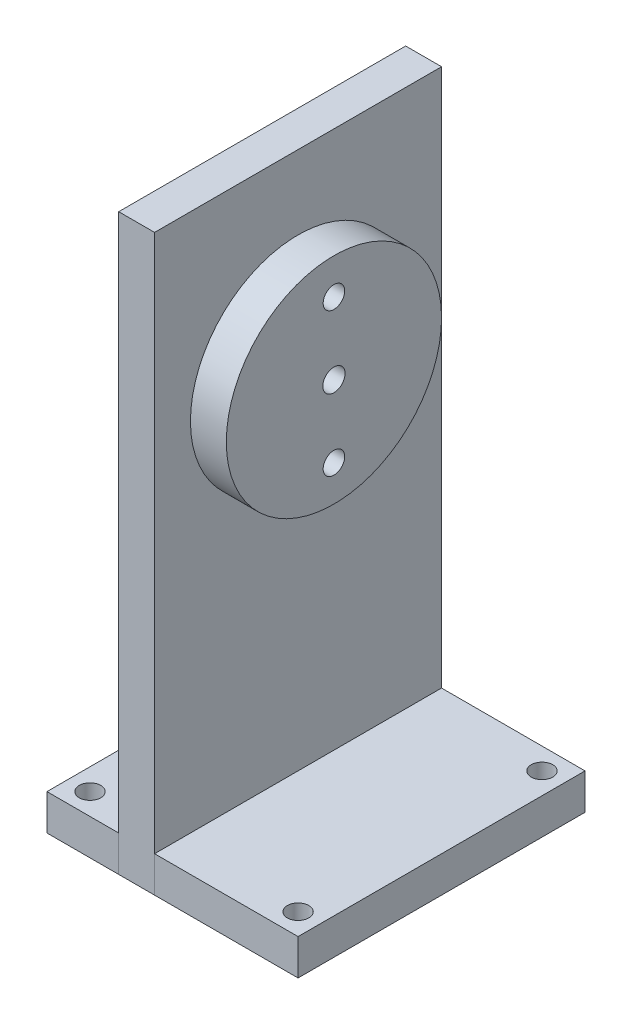
ISO-10303-21;
HEADER;
FILE_DESCRIPTION(('STEP AP214'),'2;1');
FILE_NAME('part.step','',(''),(''),'','','');
FILE_SCHEMA(('AUTOMOTIVE_DESIGN { 1 0 10303 214 1 1 1 1 }'));
ENDSEC;
DATA;
#1=APPLICATION_CONTEXT('core data for automotive mechanical design processes');
#2=APPLICATION_PROTOCOL_DEFINITION('international standard','automotive_design',2000,#1);
#3=PRODUCT_CONTEXT('',#1,'mechanical');
#4=PRODUCT('Part','Part','',(#3));
#5=PRODUCT_RELATED_PRODUCT_CATEGORY('part','',(#4));
#6=PRODUCT_DEFINITION_FORMATION('','',#4);
#7=PRODUCT_DEFINITION_CONTEXT('part definition',#1,'design');
#8=PRODUCT_DEFINITION('design','',#6,#7);
#9=PRODUCT_DEFINITION_SHAPE('','',#8);
#10=(LENGTH_UNIT() NAMED_UNIT(*) SI_UNIT(.MILLI.,.METRE.));
#11=(NAMED_UNIT(*) PLANE_ANGLE_UNIT() SI_UNIT($,.RADIAN.));
#12=(NAMED_UNIT(*) SI_UNIT($,.STERADIAN.) SOLID_ANGLE_UNIT());
#13=UNCERTAINTY_MEASURE_WITH_UNIT(LENGTH_MEASURE(1.E-05),#10,'distance_accuracy_value','');
#14=(GEOMETRIC_REPRESENTATION_CONTEXT(3) GLOBAL_UNCERTAINTY_ASSIGNED_CONTEXT((#13)) GLOBAL_UNIT_ASSIGNED_CONTEXT((#10,
#11,#12)) REPRESENTATION_CONTEXT('',''));
#15=CARTESIAN_POINT('',(0.,0.,0.));
#16=DIRECTION('',(0.,0.,1.));
#17=DIRECTION('',(1.,0.,0.));
#18=AXIS2_PLACEMENT_3D('',#15,#16,#17);
#19=CARTESIAN_POINT('',(-1.23132295065131,49.7,-17.517492558569));
#20=DIRECTION('',(-0.788010753606726,0.,0.615661475325654));
#21=DIRECTION('',(0.615661475325654,0.,0.788010753606726));
#22=AXIS2_PLACEMENT_3D('',#19,#20,#21);
#23=PLANE('',#22);
#24=DIRECTION('',(0.,-1.,0.));
#25=VECTOR('',#24,1.);
#26=CARTESIAN_POINT('',(0.,49.7,-15.9414710513555));
#27=LINE('',#26,#25);
#28=CARTESIAN_POINT('',(0.,59.7,-15.9414710513555));
#29=VERTEX_POINT('',#28);
#30=CARTESIAN_POINT('',(0.,49.7,-15.9414710513555));
#31=VERTEX_POINT('',#30);
#32=EDGE_CURVE('E104',#29,#31,#27,.T.);
#33=ORIENTED_EDGE('',*,*,#32,.T.);
#34=DIRECTION('',(0.615661475325654,0.,0.788010753606726));
#35=VECTOR('',#34,1.);
#36=CARTESIAN_POINT('',(-1.23132295065131,49.7,-17.517492558569));
#37=LINE('',#36,#35);
#38=CARTESIAN_POINT('',(-1.23132295065131,49.7,-17.517492558569));
#39=VERTEX_POINT('',#38);
#40=EDGE_CURVE('E12',#39,#31,#37,.T.);
#41=ORIENTED_EDGE('',*,*,#40,.F.);
#42=DIRECTION('',(0.,-1.,0.));
#43=VECTOR('',#42,1.);
#44=CARTESIAN_POINT('',(-1.23132295065131,49.7,-17.517492558569));
#45=LINE('',#44,#43);
#46=CARTESIAN_POINT('',(-1.23132295065131,59.7,-17.517492558569));
#47=VERTEX_POINT('',#46);
#48=EDGE_CURVE('E92',#47,#39,#45,.T.);
#49=ORIENTED_EDGE('',*,*,#48,.F.);
#50=DIRECTION('',(0.615661475325654,0.,0.788010753606726));
#51=VECTOR('',#50,1.);
#52=CARTESIAN_POINT('',(-1.23132295065131,59.7,-17.517492558569));
#53=LINE('',#52,#51);
#54=EDGE_CURVE('E100',#47,#29,#53,.T.);
#55=ORIENTED_EDGE('',*,*,#54,.T.);
#56=EDGE_LOOP('',(#33,#41,#49,#55));
#57=FACE_BOUND('',#56,.T.);
#58=ADVANCED_FACE('F41',(#57),#23,.F.);
#59=CARTESIAN_POINT('',(-15.2628261451754,49.7,-6.55488079440434));
#60=DIRECTION('',(0.,1.,0.));
#61=DIRECTION('',(0.,0.,1.));
#62=AXIS2_PLACEMENT_3D('',#59,#60,#61);
#63=PLANE('',#62);
#64=DIRECTION('',(-0.788010753606725,0.,0.615661475325654));
#65=VECTOR('',#64,1.);
#66=CARTESIAN_POINT('',(-14.0315031945241,49.7,-4.97885928719089));
#67=LINE('',#66,#65);
#68=CARTESIAN_POINT('',(-14.0315031945241,49.7,-4.97885928719089));
#69=VERTEX_POINT('',#68);
#70=EDGE_CURVE('E96',#31,#69,#67,.T.);
#71=ORIENTED_EDGE('',*,*,#70,.T.);
#72=DIRECTION('',(0.615661475325654,0.,0.788010753606726));
#73=VECTOR('',#72,1.);
#74=CARTESIAN_POINT('',(-15.2628261451754,49.7,-6.55488079440434));
#75=LINE('',#74,#73);
#76=CARTESIAN_POINT('',(-15.2628261451754,49.7,-6.55488079440434));
#77=VERTEX_POINT('',#76);
#78=EDGE_CURVE('E49',#77,#69,#75,.T.);
#79=ORIENTED_EDGE('',*,*,#78,.F.);
#80=DIRECTION('',(-0.788010753606725,0.,0.615661475325654));
#81=VECTOR('',#80,1.);
#82=CARTESIAN_POINT('',(-15.2628261451754,49.7,-6.55488079440434));
#83=LINE('',#82,#81);
#84=EDGE_CURVE('E87',#39,#77,#83,.T.);
#85=ORIENTED_EDGE('',*,*,#84,.F.);
#86=ORIENTED_EDGE('',*,*,#40,.T.);
#87=EDGE_LOOP('',(#71,#79,#85,#86));
#88=FACE_BOUND('',#87,.T.);
#89=ADVANCED_FACE('F95',(#88),#63,.F.);
#90=CARTESIAN_POINT('',(-15.2628261451754,59.7,-6.55488079440434));
#91=DIRECTION('',(0.788010753606726,0.,-0.615661475325654));
#92=DIRECTION('',(-0.615661475325654,0.,-0.788010753606726));
#93=AXIS2_PLACEMENT_3D('',#90,#91,#92);
#94=PLANE('',#93);
#95=DIRECTION('',(0.,1.,0.));
#96=VECTOR('',#95,1.);
#97=CARTESIAN_POINT('',(-14.0315031945241,59.7,-4.97885928719089));
#98=LINE('',#97,#96);
#99=CARTESIAN_POINT('',(-14.0315031945241,59.7,-4.97885928719089));
#100=VERTEX_POINT('',#99);
#101=EDGE_CURVE('E74',#69,#100,#98,.T.);
#102=ORIENTED_EDGE('',*,*,#101,.T.);
#103=DIRECTION('',(0.615661475325654,0.,0.788010753606726));
#104=VECTOR('',#103,1.);
#105=CARTESIAN_POINT('',(-15.2628261451754,59.7,-6.55488079440434));
#106=LINE('',#105,#104);
#107=CARTESIAN_POINT('',(-15.2628261451754,59.7,-6.55488079440434));
#108=VERTEX_POINT('',#107);
#109=EDGE_CURVE('E97',#108,#100,#106,.T.);
#110=ORIENTED_EDGE('',*,*,#109,.F.);
#111=DIRECTION('',(0.,1.,0.));
#112=VECTOR('',#111,1.);
#113=CARTESIAN_POINT('',(-15.2628261451754,59.7,-6.55488079440434));
#114=LINE('',#113,#112);
#115=EDGE_CURVE('E90',#77,#108,#114,.T.);
#116=ORIENTED_EDGE('',*,*,#115,.F.);
#117=ORIENTED_EDGE('',*,*,#78,.T.);
#118=EDGE_LOOP('',(#102,#110,#116,#117));
#119=FACE_BOUND('',#118,.T.);
#120=ADVANCED_FACE('F98',(#119),#94,.F.);
#121=CARTESIAN_POINT('',(-1.23132295065131,59.7,-17.517492558569));
#122=DIRECTION('',(0.,-1.,0.));
#123=DIRECTION('',(0.,0.,-1.));
#124=AXIS2_PLACEMENT_3D('',#121,#122,#123);
#125=PLANE('',#124);
#126=DIRECTION('',(0.788010753606725,0.,-0.615661475325654));
#127=VECTOR('',#126,1.);
#128=CARTESIAN_POINT('',(0.,59.7,-15.9414710513555));
#129=LINE('',#128,#127);
#130=EDGE_CURVE('E80',#100,#29,#129,.T.);
#131=ORIENTED_EDGE('',*,*,#130,.T.);
#132=ORIENTED_EDGE('',*,*,#54,.F.);
#133=DIRECTION('',(0.788010753606725,0.,-0.615661475325654));
#134=VECTOR('',#133,1.);
#135=CARTESIAN_POINT('',(-1.23132295065131,59.7,-17.517492558569));
#136=LINE('',#135,#134);
#137=EDGE_CURVE('E57',#108,#47,#136,.T.);
#138=ORIENTED_EDGE('',*,*,#137,.F.);
#139=ORIENTED_EDGE('',*,*,#109,.T.);
#140=EDGE_LOOP('',(#131,#132,#138,#139));
#141=FACE_BOUND('',#140,.T.);
#142=ADVANCED_FACE('F111',(#141),#125,.F.);
#143=CARTESIAN_POINT('',(-8.96529356649268,0.,-11.4750524805869));
#144=DIRECTION('',(0.615661475325654,0.,0.788010753606725));
#145=DIRECTION('',(0.788010753606725,0.,-0.615661475325654));
#146=AXIS2_PLACEMENT_3D('',#143,#144,#145);
#147=PLANE('',#146);
#148=ORIENTED_EDGE('',*,*,#48,.T.);
#149=ORIENTED_EDGE('',*,*,#84,.T.);
#150=ORIENTED_EDGE('',*,*,#115,.T.);
#151=ORIENTED_EDGE('',*,*,#137,.T.);
#152=EDGE_LOOP('',(#148,#149,#150,#151));
#153=FACE_BOUND('',#152,.T.);
#154=ADVANCED_FACE('F88',(#153),#147,.F.);
#155=CARTESIAN_POINT('',(-7.73397061584137,0.,-9.89903097337343));
#156=DIRECTION('',(0.615661475325654,0.,0.788010753606725));
#157=DIRECTION('',(0.788010753606725,0.,-0.615661475325654));
#158=AXIS2_PLACEMENT_3D('',#155,#156,#157);
#159=PLANE('',#158);
#160=ORIENTED_EDGE('',*,*,#32,.F.);
#161=ORIENTED_EDGE('',*,*,#130,.F.);
#162=ORIENTED_EDGE('',*,*,#101,.F.);
#163=ORIENTED_EDGE('',*,*,#70,.F.);
#164=EDGE_LOOP('',(#160,#161,#162,#163));
#165=FACE_BOUND('',#164,.T.);
#166=ADVANCED_FACE('F114',(#165),#159,.T.);
#167=CLOSED_SHELL('',(#58,#89,#120,#142,#154,#166));
#168=MANIFOLD_SOLID_BREP('B2',#167);
#169=CARTESIAN_POINT('',(10.,54.7,0.));
#170=DIRECTION('',(1.,0.,0.));
#171=DIRECTION('',(0.,0.,-1.));
#172=AXIS2_PLACEMENT_3D('',#169,#170,#171);
#173=PLANE('',#172);
#174=CARTESIAN_POINT('',(10.,64.7,0.));
#175=DIRECTION('',(1.,0.,0.));
#176=DIRECTION('',(0.,0.,-1.));
#177=AXIS2_PLACEMENT_3D('',#174,#175,#176);
#178=CIRCLE('',#177,1.5);
#179=CARTESIAN_POINT('',(10.,64.7,-1.5));
#180=VERTEX_POINT('',#179);
#181=EDGE_CURVE('E190',#180,#180,#178,.T.);
#182=ORIENTED_EDGE('',*,*,#181,.F.);
#183=EDGE_LOOP('',(#182));
#184=FACE_BOUND('',#183,.T.);
#185=CARTESIAN_POINT('',(10.,54.7,0.));
#186=DIRECTION('',(1.,0.,0.));
#187=DIRECTION('',(0.,0.,-1.));
#188=AXIS2_PLACEMENT_3D('',#185,#186,#187);
#189=CIRCLE('',#188,15.);
#190=CARTESIAN_POINT('',(10.,54.7,-15.));
#191=VERTEX_POINT('',#190);
#192=EDGE_CURVE('E40',#191,#191,#189,.T.);
#193=ORIENTED_EDGE('',*,*,#192,.T.);
#194=EDGE_LOOP('',(#193));
#195=FACE_BOUND('',#194,.T.);
#196=CARTESIAN_POINT('',(10.,54.7,0.));
#197=DIRECTION('',(1.,0.,0.));
#198=DIRECTION('',(0.,0.,-1.));
#199=AXIS2_PLACEMENT_3D('',#196,#197,#198);
#200=CIRCLE('',#199,1.55);
#201=CARTESIAN_POINT('',(10.,54.7,-1.55));
#202=VERTEX_POINT('',#201);
#203=EDGE_CURVE('E185',#202,#202,#200,.T.);
#204=ORIENTED_EDGE('',*,*,#203,.F.);
#205=EDGE_LOOP('',(#204));
#206=FACE_BOUND('',#205,.T.);
#207=CARTESIAN_POINT('',(10.,44.7,0.));
#208=DIRECTION('',(1.,0.,0.));
#209=DIRECTION('',(0.,0.,1.));
#210=AXIS2_PLACEMENT_3D('',#207,#208,#209);
#211=CIRCLE('',#210,1.5);
#212=CARTESIAN_POINT('',(10.,44.7,1.5));
#213=VERTEX_POINT('',#212);
#214=EDGE_CURVE('E196',#213,#213,#211,.T.);
#215=ORIENTED_EDGE('',*,*,#214,.F.);
#216=EDGE_LOOP('',(#215));
#217=FACE_BOUND('',#216,.T.);
#218=ADVANCED_FACE('F174',(#184,#195,#206,#217),#173,.T.);
#219=CARTESIAN_POINT('',(5.,54.7,0.));
#220=DIRECTION('',(1.,0.,0.));
#221=DIRECTION('',(0.,0.,-1.));
#222=AXIS2_PLACEMENT_3D('',#219,#220,#221);
#223=PLANE('',#222);
#224=CARTESIAN_POINT('',(5.,64.7,0.));
#225=DIRECTION('',(1.,0.,0.));
#226=DIRECTION('',(0.,0.,-1.));
#227=AXIS2_PLACEMENT_3D('',#224,#225,#226);
#228=CIRCLE('',#227,1.5);
#229=CARTESIAN_POINT('',(5.,64.7,-1.5));
#230=VERTEX_POINT('',#229);
#231=EDGE_CURVE('E193',#230,#230,#228,.T.);
#232=ORIENTED_EDGE('',*,*,#231,.T.);
#233=EDGE_LOOP('',(#232));
#234=FACE_BOUND('',#233,.T.);
#235=CARTESIAN_POINT('',(5.,54.7,0.));
#236=DIRECTION('',(1.,0.,0.));
#237=DIRECTION('',(0.,0.,-1.));
#238=AXIS2_PLACEMENT_3D('',#235,#236,#237);
#239=CIRCLE('',#238,15.);
#240=CARTESIAN_POINT('',(5.,54.7,-15.));
#241=VERTEX_POINT('',#240);
#242=EDGE_CURVE('E178',#241,#241,#239,.T.);
#243=ORIENTED_EDGE('',*,*,#242,.F.);
#244=EDGE_LOOP('',(#243));
#245=FACE_BOUND('',#244,.T.);
#246=CARTESIAN_POINT('',(5.,54.7,0.));
#247=DIRECTION('',(1.,0.,0.));
#248=DIRECTION('',(0.,0.,-1.));
#249=AXIS2_PLACEMENT_3D('',#246,#247,#248);
#250=CIRCLE('',#249,1.55);
#251=CARTESIAN_POINT('',(5.,54.7,-1.55));
#252=VERTEX_POINT('',#251);
#253=EDGE_CURVE('E187',#252,#252,#250,.T.);
#254=ORIENTED_EDGE('',*,*,#253,.T.);
#255=EDGE_LOOP('',(#254));
#256=FACE_BOUND('',#255,.T.);
#257=CARTESIAN_POINT('',(5.,44.7,0.));
#258=DIRECTION('',(1.,0.,0.));
#259=DIRECTION('',(0.,0.,1.));
#260=AXIS2_PLACEMENT_3D('',#257,#258,#259);
#261=CIRCLE('',#260,1.5);
#262=CARTESIAN_POINT('',(5.,44.7,1.5));
#263=VERTEX_POINT('',#262);
#264=EDGE_CURVE('E199',#263,#263,#261,.T.);
#265=ORIENTED_EDGE('',*,*,#264,.T.);
#266=EDGE_LOOP('',(#265));
#267=FACE_BOUND('',#266,.T.);
#268=ADVANCED_FACE('F209',(#234,#245,#256,#267),#223,.F.);
#269=CARTESIAN_POINT('',(10.,54.7,0.));
#270=DIRECTION('',(-1.,0.,0.));
#271=DIRECTION('',(0.,0.,1.));
#272=AXIS2_PLACEMENT_3D('',#269,#270,#271);
#273=CYLINDRICAL_SURFACE('',#272,15.);
#274=ORIENTED_EDGE('',*,*,#192,.F.);
#275=EDGE_LOOP('',(#274));
#276=FACE_BOUND('',#275,.T.);
#277=ORIENTED_EDGE('',*,*,#242,.T.);
#278=EDGE_LOOP('',(#277));
#279=FACE_BOUND('',#278,.T.);
#280=ADVANCED_FACE('F176',(#276,#279),#273,.T.);
#281=CARTESIAN_POINT('',(10.,54.7,0.));
#282=DIRECTION('',(-1.,0.,0.));
#283=DIRECTION('',(0.,0.,1.));
#284=AXIS2_PLACEMENT_3D('',#281,#282,#283);
#285=CYLINDRICAL_SURFACE('',#284,1.55);
#286=ORIENTED_EDGE('',*,*,#203,.T.);
#287=EDGE_LOOP('',(#286));
#288=FACE_BOUND('',#287,.T.);
#289=ORIENTED_EDGE('',*,*,#253,.F.);
#290=EDGE_LOOP('',(#289));
#291=FACE_BOUND('',#290,.T.);
#292=ADVANCED_FACE('F218',(#288,#291),#285,.F.);
#293=CARTESIAN_POINT('',(10.,64.7,0.));
#294=DIRECTION('',(-1.,0.,0.));
#295=DIRECTION('',(0.,0.,1.));
#296=AXIS2_PLACEMENT_3D('',#293,#294,#295);
#297=CYLINDRICAL_SURFACE('',#296,1.5);
#298=ORIENTED_EDGE('',*,*,#181,.T.);
#299=EDGE_LOOP('',(#298));
#300=FACE_BOUND('',#299,.T.);
#301=ORIENTED_EDGE('',*,*,#231,.F.);
#302=EDGE_LOOP('',(#301));
#303=FACE_BOUND('',#302,.T.);
#304=ADVANCED_FACE('F221',(#300,#303),#297,.F.);
#305=CARTESIAN_POINT('',(10.,44.7,0.));
#306=DIRECTION('',(-1.,0.,0.));
#307=DIRECTION('',(0.,0.,1.));
#308=AXIS2_PLACEMENT_3D('',#305,#306,#307);
#309=CYLINDRICAL_SURFACE('',#308,1.5);
#310=ORIENTED_EDGE('',*,*,#214,.T.);
#311=EDGE_LOOP('',(#310));
#312=FACE_BOUND('',#311,.T.);
#313=ORIENTED_EDGE('',*,*,#264,.F.);
#314=EDGE_LOOP('',(#313));
#315=FACE_BOUND('',#314,.T.);
#316=ADVANCED_FACE('F205',(#312,#315),#309,.F.);
#317=CLOSED_SHELL('',(#218,#268,#280,#292,#304,#316));
#318=MANIFOLD_SOLID_BREP('B6',#317);
#319=CARTESIAN_POINT('',(-14.0315031945241,49.7,-4.97885928719088));
#320=DIRECTION('',(-0.615661475325654,0.,-0.788010753606726));
#321=DIRECTION('',(-0.788010753606726,0.,0.615661475325654));
#322=AXIS2_PLACEMENT_3D('',#319,#320,#321);
#323=PLANE('',#322);
#324=DIRECTION('',(0.,1.,0.));
#325=VECTOR('',#324,1.);
#326=CARTESIAN_POINT('',(-14.0315031945241,49.7,-4.97885928719088));
#327=LINE('',#326,#325);
#328=CARTESIAN_POINT('',(-14.0315031945241,49.7,-4.97885928719088));
#329=VERTEX_POINT('',#328);
#330=CARTESIAN_POINT('',(-14.0315031945241,59.7,-4.97885928719088));
#331=VERTEX_POINT('',#330);
#332=EDGE_CURVE('E290',#329,#331,#327,.T.);
#333=ORIENTED_EDGE('',*,*,#332,.T.);
#334=DIRECTION('',(-0.788010753606726,0.,0.615661475325654));
#335=VECTOR('',#334,1.);
#336=CARTESIAN_POINT('',(-14.0315031945241,59.7,-4.97885928719088));
#337=LINE('',#336,#335);
#338=CARTESIAN_POINT('',(0.,59.7,-15.9414710513555));
#339=VERTEX_POINT('',#338);
#340=EDGE_CURVE('E345',#339,#331,#337,.T.);
#341=ORIENTED_EDGE('',*,*,#340,.F.);
#342=DIRECTION('',(0.,1.,0.));
#343=VECTOR('',#342,1.);
#344=CARTESIAN_POINT('',(0.,49.7,-15.9414710513555));
#345=LINE('',#344,#343);
#346=CARTESIAN_POINT('',(0.,49.7,-15.9414710513555));
#347=VERTEX_POINT('',#346);
#348=EDGE_CURVE('E172',#347,#339,#345,.T.);
#349=ORIENTED_EDGE('',*,*,#348,.F.);
#350=DIRECTION('',(-0.788010753606726,0.,0.615661475325654));
#351=VECTOR('',#350,1.);
#352=CARTESIAN_POINT('',(-14.0315031945241,49.7,-4.97885928719088));
#353=LINE('',#352,#351);
#354=EDGE_CURVE('E346',#347,#329,#353,.T.);
#355=ORIENTED_EDGE('',*,*,#354,.T.);
#356=EDGE_LOOP('',(#333,#341,#349,#355));
#357=FACE_BOUND('',#356,.T.);
#358=ADVANCED_FACE('F287',(#357),#323,.T.);
#359=CARTESIAN_POINT('',(0.,49.7,-9.22765968676695));
#360=DIRECTION('',(1.,0.,0.));
#361=DIRECTION('',(0.,0.,-1.));
#362=AXIS2_PLACEMENT_3D('',#359,#360,#361);
#363=PLANE('',#362);
#364=ORIENTED_EDGE('',*,*,#348,.T.);
#365=DIRECTION('',(0.,0.,-1.));
#366=VECTOR('',#365,1.);
#367=CARTESIAN_POINT('',(0.,59.7,-9.22765968676695));
#368=LINE('',#367,#366);
#369=CARTESIAN_POINT('',(0.,59.7,-9.22765968676695));
#370=VERTEX_POINT('',#369);
#371=EDGE_CURVE('E363',#370,#339,#368,.T.);
#372=ORIENTED_EDGE('',*,*,#371,.F.);
#373=DIRECTION('',(0.,1.,0.));
#374=VECTOR('',#373,1.);
#375=CARTESIAN_POINT('',(0.,49.7,-9.22765968676695));
#376=LINE('',#375,#374);
#377=CARTESIAN_POINT('',(0.,49.7,-9.22765968676695));
#378=VERTEX_POINT('',#377);
#379=EDGE_CURVE('E295',#378,#370,#376,.T.);
#380=ORIENTED_EDGE('',*,*,#379,.F.);
#381=DIRECTION('',(0.,0.,-1.));
#382=VECTOR('',#381,1.);
#383=CARTESIAN_POINT('',(0.,49.7,-9.22765968676695));
#384=LINE('',#383,#382);
#385=EDGE_CURVE('E351',#378,#347,#384,.T.);
#386=ORIENTED_EDGE('',*,*,#385,.T.);
#387=EDGE_LOOP('',(#364,#372,#380,#386));
#388=FACE_BOUND('',#387,.T.);
#389=ADVANCED_FACE('F415',(#388),#363,.T.);
#390=CARTESIAN_POINT('',(2.07862670556284,49.7,-9.22765968676695));
#391=DIRECTION('',(0.,0.,-1.));
#392=DIRECTION('',(-1.,0.,0.));
#393=AXIS2_PLACEMENT_3D('',#390,#391,#392);
#394=PLANE('',#393);
#395=ORIENTED_EDGE('',*,*,#379,.T.);
#396=DIRECTION('',(-1.,0.,0.));
#397=VECTOR('',#396,1.);
#398=CARTESIAN_POINT('',(2.07862670556284,59.7,-9.22765968676695));
#399=LINE('',#398,#397);
#400=CARTESIAN_POINT('',(2.07862670556284,59.7,-9.22765968676695));
#401=VERTEX_POINT('',#400);
#402=EDGE_CURVE('E373',#401,#370,#399,.T.);
#403=ORIENTED_EDGE('',*,*,#402,.F.);
#404=DIRECTION('',(0.,1.,0.));
#405=VECTOR('',#404,1.);
#406=CARTESIAN_POINT('',(2.07862670556284,49.7,-9.22765968676695));
#407=LINE('',#406,#405);
#408=CARTESIAN_POINT('',(2.07862670556284,49.7,-9.22765968676695));
#409=VERTEX_POINT('',#408);
#410=EDGE_CURVE('E392',#409,#401,#407,.T.);
#411=ORIENTED_EDGE('',*,*,#410,.F.);
#412=DIRECTION('',(-1.,0.,0.));
#413=VECTOR('',#412,1.);
#414=CARTESIAN_POINT('',(2.07862670556284,49.7,-9.22765968676695));
#415=LINE('',#414,#413);
#416=EDGE_CURVE('E388',#409,#378,#415,.T.);
#417=ORIENTED_EDGE('',*,*,#416,.T.);
#418=EDGE_LOOP('',(#395,#403,#411,#417));
#419=FACE_BOUND('',#418,.T.);
#420=ADVANCED_FACE('F413',(#419),#394,.T.);
#421=CARTESIAN_POINT('',(2.07862670556284,49.7,0.));
#422=DIRECTION('',(1.,0.,0.));
#423=DIRECTION('',(0.,0.,-1.));
#424=AXIS2_PLACEMENT_3D('',#421,#422,#423);
#425=PLANE('',#424);
#426=ORIENTED_EDGE('',*,*,#410,.T.);
#427=DIRECTION('',(0.,0.,-1.));
#428=VECTOR('',#427,1.);
#429=CARTESIAN_POINT('',(2.07862670556284,59.7,0.));
#430=LINE('',#429,#428);
#431=CARTESIAN_POINT('',(2.07862670556284,59.7,0.));
#432=VERTEX_POINT('',#431);
#433=EDGE_CURVE('E370',#432,#401,#430,.T.);
#434=ORIENTED_EDGE('',*,*,#433,.F.);
#435=DIRECTION('',(0.,1.,0.));
#436=VECTOR('',#435,1.);
#437=CARTESIAN_POINT('',(2.07862670556284,49.7,0.));
#438=LINE('',#437,#436);
#439=CARTESIAN_POINT('',(2.07862670556284,49.7,0.));
#440=VERTEX_POINT('',#439);
#441=EDGE_CURVE('E394',#440,#432,#438,.T.);
#442=ORIENTED_EDGE('',*,*,#441,.F.);
#443=DIRECTION('',(0.,0.,-1.));
#444=VECTOR('',#443,1.);
#445=CARTESIAN_POINT('',(2.07862670556284,49.7,0.));
#446=LINE('',#445,#444);
#447=EDGE_CURVE('E385',#440,#409,#446,.T.);
#448=ORIENTED_EDGE('',*,*,#447,.T.);
#449=EDGE_LOOP('',(#426,#434,#442,#448));
#450=FACE_BOUND('',#449,.T.);
#451=ADVANCED_FACE('F407',(#450),#425,.T.);
#452=CARTESIAN_POINT('',(0.,49.7,0.));
#453=DIRECTION('',(0.,0.,1.));
#454=DIRECTION('',(1.,0.,0.));
#455=AXIS2_PLACEMENT_3D('',#452,#453,#454);
#456=PLANE('',#455);
#457=ORIENTED_EDGE('',*,*,#441,.T.);
#458=DIRECTION('',(1.,0.,0.));
#459=VECTOR('',#458,1.);
#460=CARTESIAN_POINT('',(0.,59.7,0.));
#461=LINE('',#460,#459);
#462=CARTESIAN_POINT('',(0.,59.7,0.));
#463=VERTEX_POINT('',#462);
#464=EDGE_CURVE('E367',#463,#432,#461,.T.);
#465=ORIENTED_EDGE('',*,*,#464,.F.);
#466=DIRECTION('',(0.,1.,0.));
#467=VECTOR('',#466,1.);
#468=CARTESIAN_POINT('',(0.,49.7,0.));
#469=LINE('',#468,#467);
#470=CARTESIAN_POINT('',(0.,49.7,0.));
#471=VERTEX_POINT('',#470);
#472=EDGE_CURVE('E396',#471,#463,#469,.T.);
#473=ORIENTED_EDGE('',*,*,#472,.F.);
#474=DIRECTION('',(1.,0.,0.));
#475=VECTOR('',#474,1.);
#476=CARTESIAN_POINT('',(0.,49.7,0.));
#477=LINE('',#476,#475);
#478=EDGE_CURVE('E382',#471,#440,#477,.T.);
#479=ORIENTED_EDGE('',*,*,#478,.T.);
#480=EDGE_LOOP('',(#457,#465,#473,#479));
#481=FACE_BOUND('',#480,.T.);
#482=ADVANCED_FACE('F404',(#481),#456,.T.);
#483=CARTESIAN_POINT('',(0.,49.7,-4.97885928719088));
#484=DIRECTION('',(-1.,0.,0.));
#485=DIRECTION('',(0.,0.,1.));
#486=AXIS2_PLACEMENT_3D('',#483,#484,#485);
#487=PLANE('',#486);
#488=ORIENTED_EDGE('',*,*,#472,.T.);
#489=DIRECTION('',(0.,0.,1.));
#490=VECTOR('',#489,1.);
#491=CARTESIAN_POINT('',(0.,59.7,-4.97885928719088));
#492=LINE('',#491,#490);
#493=CARTESIAN_POINT('',(0.,59.7,-4.97885928719088));
#494=VERTEX_POINT('',#493);
#495=EDGE_CURVE('E358',#494,#463,#492,.T.);
#496=ORIENTED_EDGE('',*,*,#495,.F.);
#497=DIRECTION('',(0.,1.,0.));
#498=VECTOR('',#497,1.);
#499=CARTESIAN_POINT('',(0.,49.7,-4.97885928719088));
#500=LINE('',#499,#498);
#501=CARTESIAN_POINT('',(0.,49.7,-4.97885928719088));
#502=VERTEX_POINT('',#501);
#503=EDGE_CURVE('E350',#502,#494,#500,.T.);
#504=ORIENTED_EDGE('',*,*,#503,.F.);
#505=DIRECTION('',(0.,0.,1.));
#506=VECTOR('',#505,1.);
#507=CARTESIAN_POINT('',(0.,49.7,-4.97885928719088));
#508=LINE('',#507,#506);
#509=EDGE_CURVE('E379',#502,#471,#508,.T.);
#510=ORIENTED_EDGE('',*,*,#509,.T.);
#511=EDGE_LOOP('',(#488,#496,#504,#510));
#512=FACE_BOUND('',#511,.T.);
#513=ADVANCED_FACE('F398',(#512),#487,.T.);
#514=CARTESIAN_POINT('',(-14.0315031945241,49.7,-4.97885928719088));
#515=DIRECTION('',(0.,0.,1.));
#516=DIRECTION('',(1.,0.,0.));
#517=AXIS2_PLACEMENT_3D('',#514,#515,#516);
#518=PLANE('',#517);
#519=ORIENTED_EDGE('',*,*,#503,.T.);
#520=DIRECTION('',(1.,0.,0.));
#521=VECTOR('',#520,1.);
#522=CARTESIAN_POINT('',(-14.0315031945241,59.7,-4.97885928719088));
#523=LINE('',#522,#521);
#524=EDGE_CURVE('E353',#331,#494,#523,.T.);
#525=ORIENTED_EDGE('',*,*,#524,.F.);
#526=ORIENTED_EDGE('',*,*,#332,.F.);
#527=DIRECTION('',(1.,0.,0.));
#528=VECTOR('',#527,1.);
#529=CARTESIAN_POINT('',(-14.0315031945241,49.7,-4.97885928719088));
#530=LINE('',#529,#528);
#531=EDGE_CURVE('E377',#329,#502,#530,.T.);
#532=ORIENTED_EDGE('',*,*,#531,.T.);
#533=EDGE_LOOP('',(#519,#525,#526,#532));
#534=FACE_BOUND('',#533,.T.);
#535=ADVANCED_FACE('F354',(#534),#518,.T.);
#536=CARTESIAN_POINT('',(0.,49.7,0.));
#537=DIRECTION('',(0.,1.,0.));
#538=DIRECTION('',(0.,0.,1.));
#539=AXIS2_PLACEMENT_3D('',#536,#537,#538);
#540=PLANE('',#539);
#541=ORIENTED_EDGE('',*,*,#354,.F.);
#542=ORIENTED_EDGE('',*,*,#385,.F.);
#543=ORIENTED_EDGE('',*,*,#416,.F.);
#544=ORIENTED_EDGE('',*,*,#447,.F.);
#545=ORIENTED_EDGE('',*,*,#478,.F.);
#546=ORIENTED_EDGE('',*,*,#509,.F.);
#547=ORIENTED_EDGE('',*,*,#531,.F.);
#548=EDGE_LOOP('',(#541,#542,#543,#544,#545,#546,#547));
#549=FACE_BOUND('',#548,.T.);
#550=ADVANCED_FACE('F410',(#549),#540,.F.);
#551=CARTESIAN_POINT('',(0.,59.7,0.));
#552=DIRECTION('',(0.,1.,0.));
#553=DIRECTION('',(0.,0.,1.));
#554=AXIS2_PLACEMENT_3D('',#551,#552,#553);
#555=PLANE('',#554);
#556=ORIENTED_EDGE('',*,*,#340,.T.);
#557=ORIENTED_EDGE('',*,*,#524,.T.);
#558=ORIENTED_EDGE('',*,*,#495,.T.);
#559=ORIENTED_EDGE('',*,*,#464,.T.);
#560=ORIENTED_EDGE('',*,*,#433,.T.);
#561=ORIENTED_EDGE('',*,*,#402,.T.);
#562=ORIENTED_EDGE('',*,*,#371,.T.);
#563=EDGE_LOOP('',(#556,#557,#558,#559,#560,#561,#562));
#564=FACE_BOUND('',#563,.T.);
#565=ADVANCED_FACE('F361',(#564),#555,.T.);
#566=CLOSED_SHELL('',(#358,#389,#420,#451,#482,#513,#535,#550,#565));
#567=MANIFOLD_SOLID_BREP('B35',#566);
#568=CARTESIAN_POINT('',(5.,5.,20.));
#569=DIRECTION('',(0.,0.,1.));
#570=DIRECTION('',(0.,-1.,0.));
#571=AXIS2_PLACEMENT_3D('',#568,#569,#570);
#572=PLANE('',#571);
#573=DIRECTION('',(-1.,0.,0.));
#574=VECTOR('',#573,1.);
#575=CARTESIAN_POINT('',(5.,0.,20.));
#576=LINE('',#575,#574);
#577=CARTESIAN_POINT('',(25.,0.,20.));
#578=VERTEX_POINT('',#577);
#579=CARTESIAN_POINT('',(-10.,0.,20.));
#580=VERTEX_POINT('',#579);
#581=EDGE_CURVE('E614',#578,#580,#576,.T.);
#582=ORIENTED_EDGE('',*,*,#581,.F.);
#583=DIRECTION('',(0.,-1.,0.));
#584=VECTOR('',#583,1.);
#585=CARTESIAN_POINT('',(25.,5.,20.));
#586=LINE('',#585,#584);
#587=CARTESIAN_POINT('',(25.,5.,20.));
#588=VERTEX_POINT('',#587);
#589=EDGE_CURVE('E285',#588,#578,#586,.T.);
#590=ORIENTED_EDGE('',*,*,#589,.F.);
#591=DIRECTION('',(-1.,0.,0.));
#592=VECTOR('',#591,1.);
#593=CARTESIAN_POINT('',(-10.,5.,20.));
#594=LINE('',#593,#592);
#595=CARTESIAN_POINT('',(-10.,5.,20.));
#596=VERTEX_POINT('',#595);
#597=EDGE_CURVE('E610',#588,#596,#594,.T.);
#598=ORIENTED_EDGE('',*,*,#597,.T.);
#599=DIRECTION('',(0.,-1.,0.));
#600=VECTOR('',#599,1.);
#601=CARTESIAN_POINT('',(-10.,5.,20.));
#602=LINE('',#601,#600);
#603=EDGE_CURVE('E501',#596,#580,#602,.T.);
#604=ORIENTED_EDGE('',*,*,#603,.T.);
#605=EDGE_LOOP('',(#582,#590,#598,#604));
#606=FACE_BOUND('',#605,.T.);
#607=ADVANCED_FACE('F497',(#606),#572,.T.);
#608=CARTESIAN_POINT('',(25.,5.,20.));
#609=DIRECTION('',(1.,0.,0.));
#610=DIRECTION('',(0.,0.,-1.));
#611=AXIS2_PLACEMENT_3D('',#608,#609,#610);
#612=PLANE('',#611);
#613=DIRECTION('',(0.,0.,1.));
#614=VECTOR('',#613,1.);
#615=CARTESIAN_POINT('',(25.,0.,20.));
#616=LINE('',#615,#614);
#617=CARTESIAN_POINT('',(25.,0.,-20.));
#618=VERTEX_POINT('',#617);
#619=EDGE_CURVE('E627',#618,#578,#616,.T.);
#620=ORIENTED_EDGE('',*,*,#619,.F.);
#621=DIRECTION('',(0.,-1.,0.));
#622=VECTOR('',#621,1.);
#623=CARTESIAN_POINT('',(25.,5.,-20.));
#624=LINE('',#623,#622);
#625=CARTESIAN_POINT('',(25.,5.,-20.));
#626=VERTEX_POINT('',#625);
#627=EDGE_CURVE('E506',#626,#618,#624,.T.);
#628=ORIENTED_EDGE('',*,*,#627,.F.);
#629=DIRECTION('',(0.,0.,1.));
#630=VECTOR('',#629,1.);
#631=CARTESIAN_POINT('',(25.,5.,20.));
#632=LINE('',#631,#630);
#633=EDGE_CURVE('E619',#626,#588,#632,.T.);
#634=ORIENTED_EDGE('',*,*,#633,.T.);
#635=ORIENTED_EDGE('',*,*,#589,.T.);
#636=EDGE_LOOP('',(#620,#628,#634,#635));
#637=FACE_BOUND('',#636,.T.);
#638=ADVANCED_FACE('F645',(#637),#612,.T.);
#639=CARTESIAN_POINT('',(5.,5.,-20.));
#640=DIRECTION('',(0.,0.,-1.));
#641=DIRECTION('',(0.,1.,0.));
#642=AXIS2_PLACEMENT_3D('',#639,#640,#641);
#643=PLANE('',#642);
#644=DIRECTION('',(1.,0.,0.));
#645=VECTOR('',#644,1.);
#646=CARTESIAN_POINT('',(5.,0.,-20.));
#647=LINE('',#646,#645);
#648=CARTESIAN_POINT('',(-10.,0.,-20.));
#649=VERTEX_POINT('',#648);
#650=EDGE_CURVE('E624',#649,#618,#647,.T.);
#651=ORIENTED_EDGE('',*,*,#650,.F.);
#652=DIRECTION('',(0.,-1.,0.));
#653=VECTOR('',#652,1.);
#654=CARTESIAN_POINT('',(-10.,5.,-20.));
#655=LINE('',#654,#653);
#656=CARTESIAN_POINT('',(-10.,5.,-20.));
#657=VERTEX_POINT('',#656);
#658=EDGE_CURVE('E631',#657,#649,#655,.T.);
#659=ORIENTED_EDGE('',*,*,#658,.F.);
#660=DIRECTION('',(1.,0.,0.));
#661=VECTOR('',#660,1.);
#662=CARTESIAN_POINT('',(5.,5.,-20.));
#663=LINE('',#662,#661);
#664=EDGE_CURVE('E617',#657,#626,#663,.T.);
#665=ORIENTED_EDGE('',*,*,#664,.T.);
#666=ORIENTED_EDGE('',*,*,#627,.T.);
#667=EDGE_LOOP('',(#651,#659,#665,#666));
#668=FACE_BOUND('',#667,.T.);
#669=ADVANCED_FACE('F650',(#668),#643,.T.);
#670=CARTESIAN_POINT('',(-10.,5.,-20.));
#671=DIRECTION('',(-1.,0.,0.));
#672=DIRECTION('',(0.,0.,1.));
#673=AXIS2_PLACEMENT_3D('',#670,#671,#672);
#674=PLANE('',#673);
#675=DIRECTION('',(0.,0.,-1.));
#676=VECTOR('',#675,1.);
#677=CARTESIAN_POINT('',(-10.,0.,-20.));
#678=LINE('',#677,#676);
#679=EDGE_CURVE('E607',#580,#649,#678,.T.);
#680=ORIENTED_EDGE('',*,*,#679,.F.);
#681=ORIENTED_EDGE('',*,*,#603,.F.);
#682=DIRECTION('',(0.,0.,-1.));
#683=VECTOR('',#682,1.);
#684=CARTESIAN_POINT('',(-10.,5.,-20.));
#685=LINE('',#684,#683);
#686=EDGE_CURVE('E613',#596,#657,#685,.T.);
#687=ORIENTED_EDGE('',*,*,#686,.T.);
#688=ORIENTED_EDGE('',*,*,#658,.T.);
#689=EDGE_LOOP('',(#680,#681,#687,#688));
#690=FACE_BOUND('',#689,.T.);
#691=ADVANCED_FACE('F499',(#690),#674,.T.);
#692=CARTESIAN_POINT('',(0.,5.,0.));
#693=DIRECTION('',(0.,1.,0.));
#694=DIRECTION('',(0.,0.,1.));
#695=AXIS2_PLACEMENT_3D('',#692,#693,#694);
#696=PLANE('',#695);
#697=CARTESIAN_POINT('',(22.,5.,17.));
#698=DIRECTION('',(0.,-1.,0.));
#699=DIRECTION('',(0.,0.,1.));
#700=AXIS2_PLACEMENT_3D('',#697,#698,#699);
#701=CIRCLE('',#700,1.5);
#702=CARTESIAN_POINT('',(22.,5.,18.5));
#703=VERTEX_POINT('',#702);
#704=EDGE_CURVE('E699',#703,#703,#701,.T.);
#705=ORIENTED_EDGE('',*,*,#704,.T.);
#706=EDGE_LOOP('',(#705));
#707=FACE_BOUND('',#706,.T.);
#708=CARTESIAN_POINT('',(22.,5.,-17.));
#709=DIRECTION('',(0.,-1.,0.));
#710=DIRECTION('',(0.,0.,-1.));
#711=AXIS2_PLACEMENT_3D('',#708,#709,#710);
#712=CIRCLE('',#711,1.5);
#713=CARTESIAN_POINT('',(22.,5.,-18.5));
#714=VERTEX_POINT('',#713);
#715=EDGE_CURVE('E707',#714,#714,#712,.T.);
#716=ORIENTED_EDGE('',*,*,#715,.T.);
#717=EDGE_LOOP('',(#716));
#718=FACE_BOUND('',#717,.T.);
#719=CARTESIAN_POINT('',(-6.99999999999999,5.,-17.));
#720=DIRECTION('',(0.,-1.,0.));
#721=DIRECTION('',(0.,0.,1.));
#722=AXIS2_PLACEMENT_3D('',#719,#720,#721);
#723=CIRCLE('',#722,1.5);
#724=CARTESIAN_POINT('',(-6.99999999999999,5.,-15.5));
#725=VERTEX_POINT('',#724);
#726=EDGE_CURVE('E594',#725,#725,#723,.T.);
#727=ORIENTED_EDGE('',*,*,#726,.T.);
#728=EDGE_LOOP('',(#727));
#729=FACE_BOUND('',#728,.T.);
#730=DIRECTION('',(-1.,0.,0.));
#731=VECTOR('',#730,1.);
#732=CARTESIAN_POINT('',(0.,5.,7.));
#733=LINE('',#732,#731);
#734=CARTESIAN_POINT('',(5.,5.,7.));
#735=VERTEX_POINT('',#734);
#736=CARTESIAN_POINT('',(0.,5.,7.));
#737=VERTEX_POINT('',#736);
#738=EDGE_CURVE('E565',#735,#737,#733,.T.);
#739=ORIENTED_EDGE('',*,*,#738,.T.);
#740=DIRECTION('',(0.,0.,-1.));
#741=VECTOR('',#740,1.);
#742=CARTESIAN_POINT('',(0.,5.,7.));
#743=LINE('',#742,#741);
#744=CARTESIAN_POINT('',(0.,5.,-7.00000000000001));
#745=VERTEX_POINT('',#744);
#746=EDGE_CURVE('E574',#737,#745,#743,.T.);
#747=ORIENTED_EDGE('',*,*,#746,.T.);
#748=DIRECTION('',(1.,0.,0.));
#749=VECTOR('',#748,1.);
#750=CARTESIAN_POINT('',(0.,5.,-7.00000000000001));
#751=LINE('',#750,#749);
#752=CARTESIAN_POINT('',(5.,5.,-7.00000000000001));
#753=VERTEX_POINT('',#752);
#754=EDGE_CURVE('E514',#745,#753,#751,.T.);
#755=ORIENTED_EDGE('',*,*,#754,.T.);
#756=DIRECTION('',(0.,0.,1.));
#757=VECTOR('',#756,1.);
#758=CARTESIAN_POINT('',(5.,5.,-7.00000000000001));
#759=LINE('',#758,#757);
#760=EDGE_CURVE('E571',#753,#735,#759,.T.);
#761=ORIENTED_EDGE('',*,*,#760,.T.);
#762=EDGE_LOOP('',(#739,#747,#755,#761));
#763=FACE_BOUND('',#762,.T.);
#764=CARTESIAN_POINT('',(-7.,5.,17.));
#765=DIRECTION('',(0.,-1.,0.));
#766=DIRECTION('',(0.,0.,-1.));
#767=AXIS2_PLACEMENT_3D('',#764,#765,#766);
#768=CIRCLE('',#767,1.5);
#769=CARTESIAN_POINT('',(-7.,5.,15.5));
#770=VERTEX_POINT('',#769);
#771=EDGE_CURVE('E604',#770,#770,#768,.T.);
#772=ORIENTED_EDGE('',*,*,#771,.T.);
#773=EDGE_LOOP('',(#772));
#774=FACE_BOUND('',#773,.T.);
#775=ORIENTED_EDGE('',*,*,#597,.F.);
#776=ORIENTED_EDGE('',*,*,#633,.F.);
#777=ORIENTED_EDGE('',*,*,#664,.F.);
#778=ORIENTED_EDGE('',*,*,#686,.F.);
#779=EDGE_LOOP('',(#775,#776,#777,#778));
#780=FACE_BOUND('',#779,.T.);
#781=ADVANCED_FACE('F578',(#707,#718,#729,#763,#774,#780),#696,.T.);
#782=CARTESIAN_POINT('',(0.,0.,0.));
#783=DIRECTION('',(0.,1.,0.));
#784=DIRECTION('',(0.,0.,1.));
#785=AXIS2_PLACEMENT_3D('',#782,#783,#784);
#786=PLANE('',#785);
#787=CARTESIAN_POINT('',(22.,0.,17.));
#788=DIRECTION('',(0.,-1.,0.));
#789=DIRECTION('',(0.,0.,1.));
#790=AXIS2_PLACEMENT_3D('',#787,#788,#789);
#791=CIRCLE('',#790,1.5);
#792=CARTESIAN_POINT('',(22.,0.,18.5));
#793=VERTEX_POINT('',#792);
#794=EDGE_CURVE('E702',#793,#793,#791,.T.);
#795=ORIENTED_EDGE('',*,*,#794,.F.);
#796=EDGE_LOOP('',(#795));
#797=FACE_BOUND('',#796,.T.);
#798=CARTESIAN_POINT('',(22.,0.,-17.));
#799=DIRECTION('',(0.,-1.,0.));
#800=DIRECTION('',(0.,0.,-1.));
#801=AXIS2_PLACEMENT_3D('',#798,#799,#800);
#802=CIRCLE('',#801,1.5);
#803=CARTESIAN_POINT('',(22.,0.,-18.5));
#804=VERTEX_POINT('',#803);
#805=EDGE_CURVE('E704',#804,#804,#802,.T.);
#806=ORIENTED_EDGE('',*,*,#805,.F.);
#807=EDGE_LOOP('',(#806));
#808=FACE_BOUND('',#807,.T.);
#809=CARTESIAN_POINT('',(-6.99999999999999,0.,-17.));
#810=DIRECTION('',(0.,-1.,0.));
#811=DIRECTION('',(0.,0.,1.));
#812=AXIS2_PLACEMENT_3D('',#809,#810,#811);
#813=CIRCLE('',#812,1.5);
#814=CARTESIAN_POINT('',(-6.99999999999999,0.,-15.5));
#815=VERTEX_POINT('',#814);
#816=EDGE_CURVE('E587',#815,#815,#813,.T.);
#817=ORIENTED_EDGE('',*,*,#816,.F.);
#818=EDGE_LOOP('',(#817));
#819=FACE_BOUND('',#818,.T.);
#820=DIRECTION('',(0.,0.,-1.));
#821=VECTOR('',#820,1.);
#822=CARTESIAN_POINT('',(0.,0.,7.));
#823=LINE('',#822,#821);
#824=CARTESIAN_POINT('',(0.,0.,7.));
#825=VERTEX_POINT('',#824);
#826=CARTESIAN_POINT('',(0.,0.,-7.00000000000001));
#827=VERTEX_POINT('',#826);
#828=EDGE_CURVE('E593',#825,#827,#823,.T.);
#829=ORIENTED_EDGE('',*,*,#828,.F.);
#830=DIRECTION('',(-1.,0.,0.));
#831=VECTOR('',#830,1.);
#832=CARTESIAN_POINT('',(0.,0.,7.));
#833=LINE('',#832,#831);
#834=CARTESIAN_POINT('',(5.,0.,7.));
#835=VERTEX_POINT('',#834);
#836=EDGE_CURVE('E522',#835,#825,#833,.T.);
#837=ORIENTED_EDGE('',*,*,#836,.F.);
#838=DIRECTION('',(0.,0.,1.));
#839=VECTOR('',#838,1.);
#840=CARTESIAN_POINT('',(5.,0.,-7.00000000000001));
#841=LINE('',#840,#839);
#842=CARTESIAN_POINT('',(5.,0.,-7.00000000000001));
#843=VERTEX_POINT('',#842);
#844=EDGE_CURVE('E581',#843,#835,#841,.T.);
#845=ORIENTED_EDGE('',*,*,#844,.F.);
#846=DIRECTION('',(1.,0.,0.));
#847=VECTOR('',#846,1.);
#848=CARTESIAN_POINT('',(0.,0.,-7.00000000000001));
#849=LINE('',#848,#847);
#850=EDGE_CURVE('E584',#827,#843,#849,.T.);
#851=ORIENTED_EDGE('',*,*,#850,.F.);
#852=EDGE_LOOP('',(#829,#837,#845,#851));
#853=FACE_BOUND('',#852,.T.);
#854=CARTESIAN_POINT('',(-7.,0.,17.));
#855=DIRECTION('',(0.,-1.,0.));
#856=DIRECTION('',(0.,0.,-1.));
#857=AXIS2_PLACEMENT_3D('',#854,#855,#856);
#858=CIRCLE('',#857,1.5);
#859=CARTESIAN_POINT('',(-7.,0.,15.5));
#860=VERTEX_POINT('',#859);
#861=EDGE_CURVE('E600',#860,#860,#858,.T.);
#862=ORIENTED_EDGE('',*,*,#861,.F.);
#863=EDGE_LOOP('',(#862));
#864=FACE_BOUND('',#863,.T.);
#865=ORIENTED_EDGE('',*,*,#581,.T.);
#866=ORIENTED_EDGE('',*,*,#679,.T.);
#867=ORIENTED_EDGE('',*,*,#650,.T.);
#868=ORIENTED_EDGE('',*,*,#619,.T.);
#869=EDGE_LOOP('',(#865,#866,#867,#868));
#870=FACE_BOUND('',#869,.T.);
#871=ADVANCED_FACE('F641',(#797,#808,#819,#853,#864,#870),#786,.F.);
#872=CARTESIAN_POINT('',(-7.,5.,17.));
#873=DIRECTION('',(0.,-1.,0.));
#874=DIRECTION('',(0.,0.,-1.));
#875=AXIS2_PLACEMENT_3D('',#872,#873,#874);
#876=CYLINDRICAL_SURFACE('',#875,1.5);
#877=ORIENTED_EDGE('',*,*,#771,.F.);
#878=EDGE_LOOP('',(#877));
#879=FACE_BOUND('',#878,.T.);
#880=ORIENTED_EDGE('',*,*,#861,.T.);
#881=EDGE_LOOP('',(#880));
#882=FACE_BOUND('',#881,.T.);
#883=ADVANCED_FACE('F664',(#879,#882),#876,.F.);
#884=CARTESIAN_POINT('',(0.,5.,7.));
#885=DIRECTION('',(0.,0.,1.));
#886=DIRECTION('',(0.,-1.,0.));
#887=AXIS2_PLACEMENT_3D('',#884,#885,#886);
#888=PLANE('',#887);
#889=ORIENTED_EDGE('',*,*,#836,.T.);
#890=DIRECTION('',(0.,-1.,0.));
#891=VECTOR('',#890,1.);
#892=CARTESIAN_POINT('',(0.,5.,7.));
#893=LINE('',#892,#891);
#894=EDGE_CURVE('E561',#737,#825,#893,.T.);
#895=ORIENTED_EDGE('',*,*,#894,.F.);
#896=ORIENTED_EDGE('',*,*,#738,.F.);
#897=DIRECTION('',(0.,-1.,0.));
#898=VECTOR('',#897,1.);
#899=CARTESIAN_POINT('',(5.,5.,7.));
#900=LINE('',#899,#898);
#901=EDGE_CURVE('E598',#735,#835,#900,.T.);
#902=ORIENTED_EDGE('',*,*,#901,.T.);
#903=EDGE_LOOP('',(#889,#895,#896,#902));
#904=FACE_BOUND('',#903,.T.);
#905=ADVANCED_FACE('F563',(#904),#888,.F.);
#906=CARTESIAN_POINT('',(5.,5.,-7.00000000000001));
#907=DIRECTION('',(1.,0.,0.));
#908=DIRECTION('',(0.,0.,-1.));
#909=AXIS2_PLACEMENT_3D('',#906,#907,#908);
#910=PLANE('',#909);
#911=ORIENTED_EDGE('',*,*,#844,.T.);
#912=ORIENTED_EDGE('',*,*,#901,.F.);
#913=ORIENTED_EDGE('',*,*,#760,.F.);
#914=DIRECTION('',(0.,-1.,0.));
#915=VECTOR('',#914,1.);
#916=CARTESIAN_POINT('',(5.,5.,-7.00000000000001));
#917=LINE('',#916,#915);
#918=EDGE_CURVE('E601',#753,#843,#917,.T.);
#919=ORIENTED_EDGE('',*,*,#918,.T.);
#920=EDGE_LOOP('',(#911,#912,#913,#919));
#921=FACE_BOUND('',#920,.T.);
#922=ADVANCED_FACE('F674',(#921),#910,.F.);
#923=CARTESIAN_POINT('',(0.,5.,-7.00000000000001));
#924=DIRECTION('',(0.,0.,-1.));
#925=DIRECTION('',(-1.,0.,0.));
#926=AXIS2_PLACEMENT_3D('',#923,#924,#925);
#927=PLANE('',#926);
#928=ORIENTED_EDGE('',*,*,#850,.T.);
#929=ORIENTED_EDGE('',*,*,#918,.F.);
#930=ORIENTED_EDGE('',*,*,#754,.F.);
#931=DIRECTION('',(0.,-1.,0.));
#932=VECTOR('',#931,1.);
#933=CARTESIAN_POINT('',(0.,5.,-7.00000000000001));
#934=LINE('',#933,#932);
#935=EDGE_CURVE('E570',#745,#827,#934,.T.);
#936=ORIENTED_EDGE('',*,*,#935,.T.);
#937=EDGE_LOOP('',(#928,#929,#930,#936));
#938=FACE_BOUND('',#937,.T.);
#939=ADVANCED_FACE('F678',(#938),#927,.F.);
#940=CARTESIAN_POINT('',(0.,5.,7.));
#941=DIRECTION('',(-1.,0.,0.));
#942=DIRECTION('',(0.,0.,1.));
#943=AXIS2_PLACEMENT_3D('',#940,#941,#942);
#944=PLANE('',#943);
#945=ORIENTED_EDGE('',*,*,#828,.T.);
#946=ORIENTED_EDGE('',*,*,#935,.F.);
#947=ORIENTED_EDGE('',*,*,#746,.F.);
#948=ORIENTED_EDGE('',*,*,#894,.T.);
#949=EDGE_LOOP('',(#945,#946,#947,#948));
#950=FACE_BOUND('',#949,.T.);
#951=ADVANCED_FACE('F575',(#950),#944,.F.);
#952=CARTESIAN_POINT('',(-6.99999999999999,5.,-17.));
#953=DIRECTION('',(0.,-1.,0.));
#954=DIRECTION('',(0.,0.,-1.));
#955=AXIS2_PLACEMENT_3D('',#952,#953,#954);
#956=CYLINDRICAL_SURFACE('',#955,1.5);
#957=ORIENTED_EDGE('',*,*,#726,.F.);
#958=EDGE_LOOP('',(#957));
#959=FACE_BOUND('',#958,.T.);
#960=ORIENTED_EDGE('',*,*,#816,.T.);
#961=EDGE_LOOP('',(#960));
#962=FACE_BOUND('',#961,.T.);
#963=ADVANCED_FACE('F677',(#959,#962),#956,.F.);
#964=CARTESIAN_POINT('',(22.,5.,-17.));
#965=DIRECTION('',(0.,-1.,0.));
#966=DIRECTION('',(0.,0.,-1.));
#967=AXIS2_PLACEMENT_3D('',#964,#965,#966);
#968=CYLINDRICAL_SURFACE('',#967,1.5);
#969=ORIENTED_EDGE('',*,*,#715,.F.);
#970=EDGE_LOOP('',(#969));
#971=FACE_BOUND('',#970,.T.);
#972=ORIENTED_EDGE('',*,*,#805,.T.);
#973=EDGE_LOOP('',(#972));
#974=FACE_BOUND('',#973,.T.);
#975=ADVANCED_FACE('F686',(#971,#974),#968,.F.);
#976=CARTESIAN_POINT('',(22.,5.,17.));
#977=DIRECTION('',(0.,-1.,0.));
#978=DIRECTION('',(0.,0.,-1.));
#979=AXIS2_PLACEMENT_3D('',#976,#977,#978);
#980=CYLINDRICAL_SURFACE('',#979,1.5);
#981=ORIENTED_EDGE('',*,*,#704,.F.);
#982=EDGE_LOOP('',(#981));
#983=FACE_BOUND('',#982,.T.);
#984=ORIENTED_EDGE('',*,*,#794,.T.);
#985=EDGE_LOOP('',(#984));
#986=FACE_BOUND('',#985,.T.);
#987=ADVANCED_FACE('F690',(#983,#986),#980,.F.);
#988=CLOSED_SHELL('',(#607,#638,#669,#691,#781,#871,#883,#905,#922,#939,#951,#963,#975,#987));
#989=MANIFOLD_SOLID_BREP('B166',#988);
#990=CARTESIAN_POINT('',(5.,0.,0.));
#991=DIRECTION('',(-1.,0.,0.));
#992=DIRECTION('',(0.,0.,1.));
#993=AXIS2_PLACEMENT_3D('',#990,#991,#992);
#994=PLANE('',#993);
#995=DIRECTION('',(0.,0.,-1.));
#996=VECTOR('',#995,1.);
#997=CARTESIAN_POINT('',(5.,0.,-20.));
#998=LINE('',#997,#996);
#999=CARTESIAN_POINT('',(5.,0.,20.));
#1000=VERTEX_POINT('',#999);
#1001=CARTESIAN_POINT('',(5.,0.,-20.));
#1002=VERTEX_POINT('',#1001);
#1003=EDGE_CURVE('E833',#1000,#1002,#998,.T.);
#1004=ORIENTED_EDGE('',*,*,#1003,.T.);
#1005=DIRECTION('',(0.,1.,0.));
#1006=VECTOR('',#1005,1.);
#1007=CARTESIAN_POINT('',(5.,80.,-20.));
#1008=LINE('',#1007,#1006);
#1009=CARTESIAN_POINT('',(5.,80.,-20.));
#1010=VERTEX_POINT('',#1009);
#1011=EDGE_CURVE('E864',#1002,#1010,#1008,.T.);
#1012=ORIENTED_EDGE('',*,*,#1011,.T.);
#1013=DIRECTION('',(0.,0.,1.));
#1014=VECTOR('',#1013,1.);
#1015=CARTESIAN_POINT('',(5.,80.,20.));
#1016=LINE('',#1015,#1014);
#1017=CARTESIAN_POINT('',(5.,80.,20.));
#1018=VERTEX_POINT('',#1017);
#1019=EDGE_CURVE('E868',#1010,#1018,#1016,.T.);
#1020=ORIENTED_EDGE('',*,*,#1019,.T.);
#1021=DIRECTION('',(0.,-1.,0.));
#1022=VECTOR('',#1021,1.);
#1023=CARTESIAN_POINT('',(5.,0.,20.));
#1024=LINE('',#1023,#1022);
#1025=EDGE_CURVE('E875',#1018,#1000,#1024,.T.);
#1026=ORIENTED_EDGE('',*,*,#1025,.T.);
#1027=EDGE_LOOP('',(#1004,#1012,#1020,#1026));
#1028=FACE_BOUND('',#1027,.T.);
#1029=CARTESIAN_POINT('',(5.,54.7,0.));
#1030=DIRECTION('',(1.,0.,0.));
#1031=DIRECTION('',(0.,0.,-1.));
#1032=AXIS2_PLACEMENT_3D('',#1029,#1030,#1031);
#1033=CIRCLE('',#1032,1.2);
#1034=CARTESIAN_POINT('',(5.,54.7,-1.2));
#1035=VERTEX_POINT('',#1034);
#1036=EDGE_CURVE('E882',#1035,#1035,#1033,.T.);
#1037=ORIENTED_EDGE('',*,*,#1036,.F.);
#1038=EDGE_LOOP('',(#1037));
#1039=FACE_BOUND('',#1038,.T.);
#1040=ADVANCED_FACE('F816',(#1028,#1039),#994,.F.);
#1041=CARTESIAN_POINT('',(0.,0.,0.));
#1042=DIRECTION('',(-1.,0.,0.));
#1043=DIRECTION('',(0.,0.,1.));
#1044=AXIS2_PLACEMENT_3D('',#1041,#1042,#1043);
#1045=PLANE('',#1044);
#1046=DIRECTION('',(0.,1.,0.));
#1047=VECTOR('',#1046,1.);
#1048=CARTESIAN_POINT('',(0.,80.,-20.));
#1049=LINE('',#1048,#1047);
#1050=CARTESIAN_POINT('',(0.,0.,-20.));
#1051=VERTEX_POINT('',#1050);
#1052=CARTESIAN_POINT('',(0.,80.,-20.));
#1053=VERTEX_POINT('',#1052);
#1054=EDGE_CURVE('E871',#1051,#1053,#1049,.T.);
#1055=ORIENTED_EDGE('',*,*,#1054,.F.);
#1056=DIRECTION('',(0.,0.,-1.));
#1057=VECTOR('',#1056,1.);
#1058=CARTESIAN_POINT('',(0.,0.,0.));
#1059=LINE('',#1058,#1057);
#1060=CARTESIAN_POINT('',(0.,0.,20.));
#1061=VERTEX_POINT('',#1060);
#1062=EDGE_CURVE('E885',#1061,#1051,#1059,.T.);
#1063=ORIENTED_EDGE('',*,*,#1062,.F.);
#1064=DIRECTION('',(0.,-1.,0.));
#1065=VECTOR('',#1064,1.);
#1066=CARTESIAN_POINT('',(0.,0.,20.));
#1067=LINE('',#1066,#1065);
#1068=CARTESIAN_POINT('',(0.,80.,20.));
#1069=VERTEX_POINT('',#1068);
#1070=EDGE_CURVE('E858',#1069,#1061,#1067,.T.);
#1071=ORIENTED_EDGE('',*,*,#1070,.F.);
#1072=DIRECTION('',(0.,0.,1.));
#1073=VECTOR('',#1072,1.);
#1074=CARTESIAN_POINT('',(0.,80.,20.));
#1075=LINE('',#1074,#1073);
#1076=EDGE_CURVE('E851',#1053,#1069,#1075,.T.);
#1077=ORIENTED_EDGE('',*,*,#1076,.F.);
#1078=EDGE_LOOP('',(#1055,#1063,#1071,#1077));
#1079=FACE_BOUND('',#1078,.T.);
#1080=CARTESIAN_POINT('',(0.,54.7,0.));
#1081=DIRECTION('',(1.,0.,0.));
#1082=DIRECTION('',(0.,0.,-1.));
#1083=AXIS2_PLACEMENT_3D('',#1080,#1081,#1082);
#1084=CIRCLE('',#1083,1.2);
#1085=CARTESIAN_POINT('',(0.,54.7,-1.2));
#1086=VERTEX_POINT('',#1085);
#1087=EDGE_CURVE('E958',#1086,#1086,#1084,.T.);
#1088=ORIENTED_EDGE('',*,*,#1087,.T.);
#1089=EDGE_LOOP('',(#1088));
#1090=FACE_BOUND('',#1089,.T.);
#1091=ADVANCED_FACE('F891',(#1079,#1090),#1045,.T.);
#1092=CARTESIAN_POINT('',(5.,80.,-20.));
#1093=DIRECTION('',(0.,0.,1.));
#1094=DIRECTION('',(0.,-1.,0.));
#1095=AXIS2_PLACEMENT_3D('',#1092,#1093,#1094);
#1096=PLANE('',#1095);
#1097=ORIENTED_EDGE('',*,*,#1054,.T.);
#1098=DIRECTION('',(-1.,0.,0.));
#1099=VECTOR('',#1098,1.);
#1100=CARTESIAN_POINT('',(5.,80.,-20.));
#1101=LINE('',#1100,#1099);
#1102=EDGE_CURVE('E825',#1010,#1053,#1101,.T.);
#1103=ORIENTED_EDGE('',*,*,#1102,.F.);
#1104=ORIENTED_EDGE('',*,*,#1011,.F.);
#1105=DIRECTION('',(-1.,0.,0.));
#1106=VECTOR('',#1105,1.);
#1107=CARTESIAN_POINT('',(5.,0.,-20.));
#1108=LINE('',#1107,#1106);
#1109=EDGE_CURVE('E495',#1002,#1051,#1108,.T.);
#1110=ORIENTED_EDGE('',*,*,#1109,.T.);
#1111=EDGE_LOOP('',(#1097,#1103,#1104,#1110));
#1112=FACE_BOUND('',#1111,.T.);
#1113=ADVANCED_FACE('F818',(#1112),#1096,.F.);
#1114=CARTESIAN_POINT('',(5.,80.,20.));
#1115=DIRECTION('',(0.,-1.,0.));
#1116=DIRECTION('',(0.,0.,-1.));
#1117=AXIS2_PLACEMENT_3D('',#1114,#1115,#1116);
#1118=PLANE('',#1117);
#1119=ORIENTED_EDGE('',*,*,#1076,.T.);
#1120=DIRECTION('',(-1.,0.,0.));
#1121=VECTOR('',#1120,1.);
#1122=CARTESIAN_POINT('',(5.,80.,20.));
#1123=LINE('',#1122,#1121);
#1124=EDGE_CURVE('E872',#1018,#1069,#1123,.T.);
#1125=ORIENTED_EDGE('',*,*,#1124,.F.);
#1126=ORIENTED_EDGE('',*,*,#1019,.F.);
#1127=ORIENTED_EDGE('',*,*,#1102,.T.);
#1128=EDGE_LOOP('',(#1119,#1125,#1126,#1127));
#1129=FACE_BOUND('',#1128,.T.);
#1130=ADVANCED_FACE('F873',(#1129),#1118,.F.);
#1131=CARTESIAN_POINT('',(5.,0.,20.));
#1132=DIRECTION('',(0.,0.,-1.));
#1133=DIRECTION('',(-1.,0.,0.));
#1134=AXIS2_PLACEMENT_3D('',#1131,#1132,#1133);
#1135=PLANE('',#1134);
#1136=ORIENTED_EDGE('',*,*,#1070,.T.);
#1137=DIRECTION('',(-1.,0.,0.));
#1138=VECTOR('',#1137,1.);
#1139=CARTESIAN_POINT('',(5.,0.,20.));
#1140=LINE('',#1139,#1138);
#1141=EDGE_CURVE('E877',#1000,#1061,#1140,.T.);
#1142=ORIENTED_EDGE('',*,*,#1141,.F.);
#1143=ORIENTED_EDGE('',*,*,#1025,.F.);
#1144=ORIENTED_EDGE('',*,*,#1124,.T.);
#1145=EDGE_LOOP('',(#1136,#1142,#1143,#1144));
#1146=FACE_BOUND('',#1145,.T.);
#1147=ADVANCED_FACE('F888',(#1146),#1135,.F.);
#1148=CARTESIAN_POINT('',(5.,0.,0.));
#1149=DIRECTION('',(0.,1.,0.));
#1150=DIRECTION('',(0.,0.,1.));
#1151=AXIS2_PLACEMENT_3D('',#1148,#1149,#1150);
#1152=PLANE('',#1151);
#1153=ORIENTED_EDGE('',*,*,#1062,.T.);
#1154=ORIENTED_EDGE('',*,*,#1109,.F.);
#1155=ORIENTED_EDGE('',*,*,#1003,.F.);
#1156=ORIENTED_EDGE('',*,*,#1141,.T.);
#1157=EDGE_LOOP('',(#1153,#1154,#1155,#1156));
#1158=FACE_BOUND('',#1157,.T.);
#1159=ADVANCED_FACE('F893',(#1158),#1152,.F.);
#1160=CARTESIAN_POINT('',(5.,54.7,0.));
#1161=DIRECTION('',(-1.,0.,0.));
#1162=DIRECTION('',(0.,0.,1.));
#1163=AXIS2_PLACEMENT_3D('',#1160,#1161,#1162);
#1164=CYLINDRICAL_SURFACE('',#1163,1.2);
#1165=ORIENTED_EDGE('',*,*,#1036,.T.);
#1166=EDGE_LOOP('',(#1165));
#1167=FACE_BOUND('',#1166,.T.);
#1168=ORIENTED_EDGE('',*,*,#1087,.F.);
#1169=EDGE_LOOP('',(#1168));
#1170=FACE_BOUND('',#1169,.T.);
#1171=ADVANCED_FACE('F895',(#1167,#1170),#1164,.F.);
#1172=CLOSED_SHELL('',(#1040,#1091,#1113,#1130,#1147,#1159,#1171));
#1173=MANIFOLD_SOLID_BREP('B279',#1172);
#1174=ADVANCED_BREP_SHAPE_REPRESENTATION('',(#18,#168,#318,#567,#989,#1173),#14);
#1175=SHAPE_DEFINITION_REPRESENTATION(#9,#1174);
ENDSEC;
END-ISO-10303-21;
